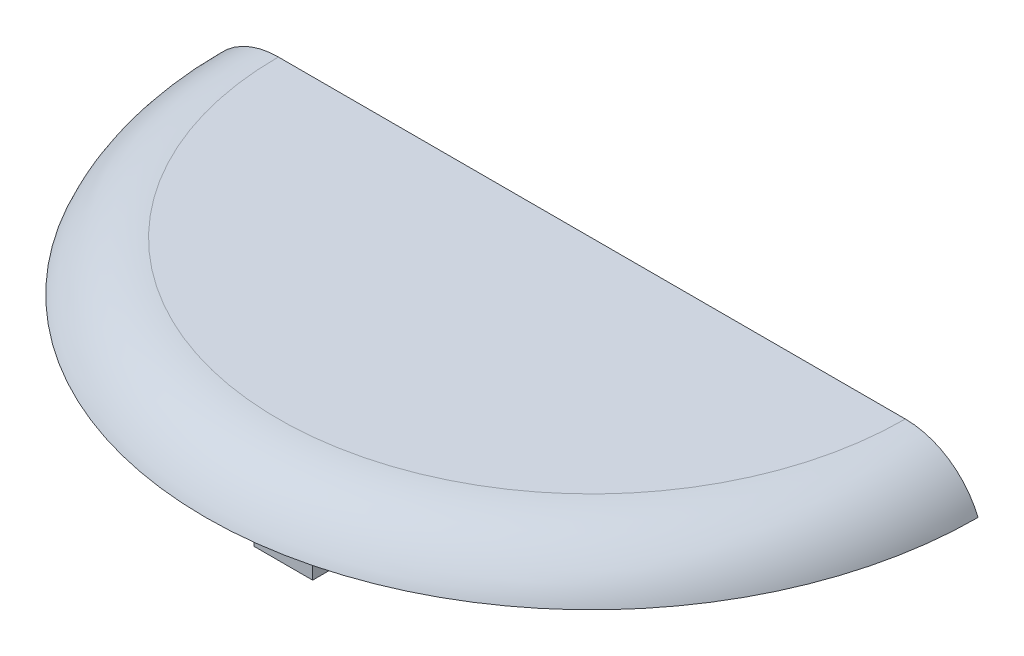
ISO-10303-21;
HEADER;
FILE_DESCRIPTION(('STEP AP214'),'2;1');
FILE_NAME('part.step','',(''),(''),'','','');
FILE_SCHEMA(('AUTOMOTIVE_DESIGN { 1 0 10303 214 1 1 1 1 }'));
ENDSEC;
DATA;
#1=APPLICATION_CONTEXT('core data for automotive mechanical design processes');
#2=APPLICATION_PROTOCOL_DEFINITION('international standard','automotive_design',2000,#1);
#3=PRODUCT_CONTEXT('',#1,'mechanical');
#4=PRODUCT('Part','Part','',(#3));
#5=PRODUCT_RELATED_PRODUCT_CATEGORY('part','',(#4));
#6=PRODUCT_DEFINITION_FORMATION('','',#4);
#7=PRODUCT_DEFINITION_CONTEXT('part definition',#1,'design');
#8=PRODUCT_DEFINITION('design','',#6,#7);
#9=PRODUCT_DEFINITION_SHAPE('','',#8);
#10=(LENGTH_UNIT() NAMED_UNIT(*) SI_UNIT(.MILLI.,.METRE.));
#11=(NAMED_UNIT(*) PLANE_ANGLE_UNIT() SI_UNIT($,.RADIAN.));
#12=(NAMED_UNIT(*) SI_UNIT($,.STERADIAN.) SOLID_ANGLE_UNIT());
#13=UNCERTAINTY_MEASURE_WITH_UNIT(LENGTH_MEASURE(1.E-05),#10,'distance_accuracy_value','');
#14=(GEOMETRIC_REPRESENTATION_CONTEXT(3) GLOBAL_UNCERTAINTY_ASSIGNED_CONTEXT((#13)) GLOBAL_UNIT_ASSIGNED_CONTEXT((#10,
#11,#12)) REPRESENTATION_CONTEXT('',''));
#15=CARTESIAN_POINT('',(0.,0.,0.));
#16=DIRECTION('',(0.,0.,1.));
#17=DIRECTION('',(1.,0.,0.));
#18=AXIS2_PLACEMENT_3D('',#15,#16,#17);
#19=CARTESIAN_POINT('',(0.,58.4278760968653,0.));
#20=DIRECTION('',(0.,1.,0.));
#21=DIRECTION('',(0.,0.,1.));
#22=AXIS2_PLACEMENT_3D('',#19,#20,#21);
#23=PLANE('',#22);
#24=DIRECTION('',(1.,0.,0.));
#25=VECTOR('',#24,1.);
#26=CARTESIAN_POINT('',(-3.,58.4278760968653,31.5));
#27=LINE('',#26,#25);
#28=CARTESIAN_POINT('',(-3.,58.4278760968653,31.5));
#29=VERTEX_POINT('',#28);
#30=CARTESIAN_POINT('',(3.,58.4278760968653,31.5));
#31=VERTEX_POINT('',#30);
#32=EDGE_CURVE('E123',#29,#31,#27,.T.);
#33=ORIENTED_EDGE('',*,*,#32,.T.);
#34=DIRECTION('',(0.,0.,-1.));
#35=VECTOR('',#34,1.);
#36=CARTESIAN_POINT('',(3.,58.4278760968653,28.5));
#37=LINE('',#36,#35);
#38=CARTESIAN_POINT('',(3.,58.4278760968653,28.5));
#39=VERTEX_POINT('',#38);
#40=EDGE_CURVE('E133',#31,#39,#37,.T.);
#41=ORIENTED_EDGE('',*,*,#40,.T.);
#42=DIRECTION('',(-1.,0.,0.));
#43=VECTOR('',#42,1.);
#44=CARTESIAN_POINT('',(-3.,58.4278760968653,28.5));
#45=LINE('',#44,#43);
#46=CARTESIAN_POINT('',(-3.,58.4278760968653,28.5));
#47=VERTEX_POINT('',#46);
#48=EDGE_CURVE('E100',#39,#47,#45,.T.);
#49=ORIENTED_EDGE('',*,*,#48,.T.);
#50=DIRECTION('',(0.,0.,1.));
#51=VECTOR('',#50,1.);
#52=CARTESIAN_POINT('',(-3.,58.4278760968653,28.5));
#53=LINE('',#52,#51);
#54=EDGE_CURVE('E57',#47,#29,#53,.T.);
#55=ORIENTED_EDGE('',*,*,#54,.T.);
#56=EDGE_LOOP('',(#33,#41,#49,#55));
#57=FACE_BOUND('',#56,.T.);
#58=CARTESIAN_POINT('',(0.,58.4278760968653,0.));
#59=DIRECTION('',(0.,1.,0.));
#60=DIRECTION('',(0.,0.,1.));
#61=AXIS2_PLACEMENT_3D('',#58,#59,#60);
#62=CIRCLE('',#61,39.4161984870957);
#63=CARTESIAN_POINT('',(39.4161984870957,58.4278760968653,0.));
#64=VERTEX_POINT('',#63);
#65=CARTESIAN_POINT('',(-39.4161984870957,58.4278760968653,2.77280175019557E-13));
#66=VERTEX_POINT('',#65);
#67=EDGE_CURVE('E12',#64,#66,#62,.F.);
#68=ORIENTED_EDGE('',*,*,#67,.T.);
#69=DIRECTION('',(-1.,0.,0.));
#70=VECTOR('',#69,1.);
#71=CARTESIAN_POINT('',(21.,58.4278760968653,0.));
#72=LINE('',#71,#70);
#73=EDGE_CURVE('E50',#64,#66,#72,.T.);
#74=ORIENTED_EDGE('',*,*,#73,.F.);
#75=EDGE_LOOP('',(#68,#74));
#76=FACE_BOUND('',#75,.T.);
#77=ADVANCED_FACE('F42',(#57,#76),#23,.F.);
#78=CARTESIAN_POINT('',(0.,60.9278760968653,15.));
#79=DIRECTION('',(0.,0.,-1.));
#80=DIRECTION('',(-1.,0.,0.));
#81=AXIS2_PLACEMENT_3D('',#78,#79,#80);
#82=PLANE('',#81);
#83=CARTESIAN_POINT('',(0.,60.9278760968653,15.));
#84=DIRECTION('',(0.,0.,-1.));
#85=DIRECTION('',(-1.,0.,0.));
#86=AXIS2_PLACEMENT_3D('',#83,#84,#85);
#87=CIRCLE('',#86,1.);
#88=CARTESIAN_POINT('',(-1.,60.9278760968653,15.));
#89=VERTEX_POINT('',#88);
#90=EDGE_CURVE('E165',#89,#89,#87,.T.);
#91=ORIENTED_EDGE('',*,*,#90,.T.);
#92=EDGE_LOOP('',(#91));
#93=FACE_BOUND('',#92,.T.);
#94=ADVANCED_FACE('F204',(#93),#82,.T.);
#95=CARTESIAN_POINT('',(-30.4161984870957,60.9278760968653,15.));
#96=DIRECTION('',(0.,0.,-1.));
#97=DIRECTION('',(-1.,0.,0.));
#98=AXIS2_PLACEMENT_3D('',#95,#96,#97);
#99=PLANE('',#98);
#100=CARTESIAN_POINT('',(-30.4161984870957,60.9278760968653,15.));
#101=DIRECTION('',(0.,0.,-1.));
#102=DIRECTION('',(-1.,0.,0.));
#103=AXIS2_PLACEMENT_3D('',#100,#101,#102);
#104=CIRCLE('',#103,0.999999999999998);
#105=CARTESIAN_POINT('',(-31.4161984870957,60.9278760968653,15.));
#106=VERTEX_POINT('',#105);
#107=EDGE_CURVE('E157',#106,#106,#104,.T.);
#108=ORIENTED_EDGE('',*,*,#107,.T.);
#109=EDGE_LOOP('',(#108));
#110=FACE_BOUND('',#109,.T.);
#111=ADVANCED_FACE('F200',(#110),#99,.T.);
#112=CARTESIAN_POINT('',(30.4161984870957,60.9278760968653,15.));
#113=DIRECTION('',(0.,0.,-1.));
#114=DIRECTION('',(-1.,0.,0.));
#115=AXIS2_PLACEMENT_3D('',#112,#113,#114);
#116=PLANE('',#115);
#117=CARTESIAN_POINT('',(30.4161984870957,60.9278760968653,15.));
#118=DIRECTION('',(0.,0.,-1.));
#119=DIRECTION('',(-1.,0.,0.));
#120=AXIS2_PLACEMENT_3D('',#117,#118,#119);
#121=CIRCLE('',#120,1.);
#122=CARTESIAN_POINT('',(29.4161984870957,60.9278760968653,15.));
#123=VERTEX_POINT('',#122);
#124=EDGE_CURVE('E148',#123,#123,#121,.T.);
#125=ORIENTED_EDGE('',*,*,#124,.T.);
#126=EDGE_LOOP('',(#125));
#127=FACE_BOUND('',#126,.T.);
#128=ADVANCED_FACE('F193',(#127),#116,.T.);
#129=CARTESIAN_POINT('',(0.,63.4278760968653,0.));
#130=DIRECTION('',(0.,1.,0.));
#131=DIRECTION('',(0.,0.,1.));
#132=AXIS2_PLACEMENT_3D('',#129,#130,#131);
#133=PLANE('',#132);
#134=DIRECTION('',(1.,0.,0.));
#135=VECTOR('',#134,1.);
#136=CARTESIAN_POINT('',(0.,63.4278760968653,0.));
#137=LINE('',#136,#135);
#138=CARTESIAN_POINT('',(-32.,63.4278760968653,2.51386656396706E-13));
#139=VERTEX_POINT('',#138);
#140=CARTESIAN_POINT('',(32.,63.4278760968653,0.));
#141=VERTEX_POINT('',#140);
#142=EDGE_CURVE('E181',#139,#141,#137,.T.);
#143=ORIENTED_EDGE('',*,*,#142,.F.);
#144=CARTESIAN_POINT('',(0.,63.4278760968653,0.));
#145=DIRECTION('',(0.,-1.,0.));
#146=DIRECTION('',(0.,0.,-1.));
#147=AXIS2_PLACEMENT_3D('',#144,#145,#146);
#148=CIRCLE('',#147,32.);
#149=EDGE_CURVE('E177',#141,#139,#148,.T.);
#150=ORIENTED_EDGE('',*,*,#149,.F.);
#151=EDGE_LOOP('',(#143,#150));
#152=FACE_BOUND('',#151,.T.);
#153=ADVANCED_FACE('F191',(#152),#133,.T.);
#154=CARTESIAN_POINT('',(0.,55.4278760968653,0.));
#155=DIRECTION('',(0.,-1.,0.));
#156=DIRECTION('',(0.,0.,-1.));
#157=AXIS2_PLACEMENT_3D('',#154,#155,#156);
#158=TOROIDAL_SURFACE('',#157,32.,8.);
#159=ORIENTED_EDGE('',*,*,#67,.F.);
#160=CARTESIAN_POINT('',(32.,55.4278760968653,-1.1172740284298E-13));
#161=DIRECTION('',(0.,0.,1.));
#162=DIRECTION('',(1.,0.,0.));
#163=AXIS2_PLACEMENT_3D('',#160,#161,#162);
#164=CIRCLE('',#163,8.);
#165=EDGE_CURVE('E152',#141,#64,#164,.F.);
#166=ORIENTED_EDGE('',*,*,#165,.F.);
#167=ORIENTED_EDGE('',*,*,#149,.T.);
#168=CARTESIAN_POINT('',(-32.,55.4278760968653,1.1172740284298E-13));
#169=DIRECTION('',(0.,0.,1.));
#170=DIRECTION('',(1.,0.,0.));
#171=AXIS2_PLACEMENT_3D('',#168,#169,#170);
#172=CIRCLE('',#171,8.);
#173=EDGE_CURVE('E174',#66,#139,#172,.F.);
#174=ORIENTED_EDGE('',*,*,#173,.F.);
#175=EDGE_LOOP('',(#159,#166,#167,#174));
#176=FACE_BOUND('',#175,.T.);
#177=ADVANCED_FACE('F190',(#176),#158,.T.);
#178=CARTESIAN_POINT('',(0.,60.9278760968653,15.));
#179=DIRECTION('',(0.,0.,-1.));
#180=DIRECTION('',(-1.,0.,0.));
#181=AXIS2_PLACEMENT_3D('',#178,#179,#180);
#182=CYLINDRICAL_SURFACE('',#181,1.);
#183=ORIENTED_EDGE('',*,*,#90,.F.);
#184=EDGE_LOOP('',(#183));
#185=FACE_BOUND('',#184,.T.);
#186=CARTESIAN_POINT('',(0.,60.9278760968653,0.));
#187=DIRECTION('',(0.,0.,-1.));
#188=DIRECTION('',(-1.,0.,0.));
#189=AXIS2_PLACEMENT_3D('',#186,#187,#188);
#190=CIRCLE('',#189,1.);
#191=CARTESIAN_POINT('',(-1.,60.9278760968653,0.));
#192=VERTEX_POINT('',#191);
#193=EDGE_CURVE('E142',#192,#192,#190,.T.);
#194=ORIENTED_EDGE('',*,*,#193,.T.);
#195=EDGE_LOOP('',(#194));
#196=FACE_BOUND('',#195,.T.);
#197=ADVANCED_FACE('F197',(#185,#196),#182,.F.);
#198=CARTESIAN_POINT('',(-30.4161984870957,60.9278760968653,15.));
#199=DIRECTION('',(0.,0.,-1.));
#200=DIRECTION('',(-1.,0.,0.));
#201=AXIS2_PLACEMENT_3D('',#198,#199,#200);
#202=CYLINDRICAL_SURFACE('',#201,0.999999999999998);
#203=ORIENTED_EDGE('',*,*,#107,.F.);
#204=EDGE_LOOP('',(#203));
#205=FACE_BOUND('',#204,.T.);
#206=CARTESIAN_POINT('',(-30.4161984870957,60.9278760968653,0.));
#207=DIRECTION('',(0.,0.,-1.));
#208=DIRECTION('',(-1.,0.,0.));
#209=AXIS2_PLACEMENT_3D('',#206,#207,#208);
#210=CIRCLE('',#209,0.999999999999998);
#211=CARTESIAN_POINT('',(-31.4161984870957,60.9278760968653,0.));
#212=VERTEX_POINT('',#211);
#213=EDGE_CURVE('E161',#212,#212,#210,.T.);
#214=ORIENTED_EDGE('',*,*,#213,.T.);
#215=EDGE_LOOP('',(#214));
#216=FACE_BOUND('',#215,.T.);
#217=ADVANCED_FACE('F223',(#205,#216),#202,.F.);
#218=CARTESIAN_POINT('',(30.4161984870957,60.9278760968653,15.));
#219=DIRECTION('',(0.,0.,-1.));
#220=DIRECTION('',(-1.,0.,0.));
#221=AXIS2_PLACEMENT_3D('',#218,#219,#220);
#222=CYLINDRICAL_SURFACE('',#221,1.);
#223=ORIENTED_EDGE('',*,*,#124,.F.);
#224=EDGE_LOOP('',(#223));
#225=FACE_BOUND('',#224,.T.);
#226=CARTESIAN_POINT('',(30.4161984870957,60.9278760968653,0.));
#227=DIRECTION('',(0.,0.,-1.));
#228=DIRECTION('',(-1.,0.,0.));
#229=AXIS2_PLACEMENT_3D('',#226,#227,#228);
#230=CIRCLE('',#229,1.);
#231=CARTESIAN_POINT('',(29.4161984870957,60.9278760968653,0.));
#232=VERTEX_POINT('',#231);
#233=EDGE_CURVE('E153',#232,#232,#230,.T.);
#234=ORIENTED_EDGE('',*,*,#233,.T.);
#235=EDGE_LOOP('',(#234));
#236=FACE_BOUND('',#235,.T.);
#237=ADVANCED_FACE('F215',(#225,#236),#222,.F.);
#238=CARTESIAN_POINT('',(21.,73.,0.));
#239=DIRECTION('',(0.,0.,1.));
#240=DIRECTION('',(1.,0.,0.));
#241=AXIS2_PLACEMENT_3D('',#238,#239,#240);
#242=PLANE('',#241);
#243=ORIENTED_EDGE('',*,*,#233,.F.);
#244=EDGE_LOOP('',(#243));
#245=FACE_BOUND('',#244,.T.);
#246=ORIENTED_EDGE('',*,*,#213,.F.);
#247=EDGE_LOOP('',(#246));
#248=FACE_BOUND('',#247,.T.);
#249=ORIENTED_EDGE('',*,*,#193,.F.);
#250=EDGE_LOOP('',(#249));
#251=FACE_BOUND('',#250,.T.);
#252=ORIENTED_EDGE('',*,*,#165,.T.);
#253=ORIENTED_EDGE('',*,*,#73,.T.);
#254=ORIENTED_EDGE('',*,*,#173,.T.);
#255=ORIENTED_EDGE('',*,*,#142,.T.);
#256=EDGE_LOOP('',(#252,#253,#254,#255));
#257=FACE_BOUND('',#256,.T.);
#258=ADVANCED_FACE('F185',(#245,#248,#251,#257),#242,.F.);
#259=CARTESIAN_POINT('',(3.,50.4278760968653,28.5));
#260=DIRECTION('',(1.,0.,0.));
#261=DIRECTION('',(0.,0.,-1.));
#262=AXIS2_PLACEMENT_3D('',#259,#260,#261);
#263=PLANE('',#262);
#264=ORIENTED_EDGE('',*,*,#40,.F.);
#265=DIRECTION('',(0.,1.,0.));
#266=VECTOR('',#265,1.);
#267=CARTESIAN_POINT('',(3.,50.4278760968653,31.5));
#268=LINE('',#267,#266);
#269=CARTESIAN_POINT('',(3.,50.4278760968653,31.5));
#270=VERTEX_POINT('',#269);
#271=EDGE_CURVE('E121',#270,#31,#268,.T.);
#272=ORIENTED_EDGE('',*,*,#271,.F.);
#273=DIRECTION('',(0.,0.,-1.));
#274=VECTOR('',#273,1.);
#275=CARTESIAN_POINT('',(3.,50.4278760968653,28.5));
#276=LINE('',#275,#274);
#277=CARTESIAN_POINT('',(3.,50.4278760968653,28.5));
#278=VERTEX_POINT('',#277);
#279=EDGE_CURVE('E114',#270,#278,#276,.T.);
#280=ORIENTED_EDGE('',*,*,#279,.T.);
#281=DIRECTION('',(0.,1.,0.));
#282=VECTOR('',#281,1.);
#283=CARTESIAN_POINT('',(3.,50.4278760968653,28.5));
#284=LINE('',#283,#282);
#285=EDGE_CURVE('E95',#278,#39,#284,.T.);
#286=ORIENTED_EDGE('',*,*,#285,.T.);
#287=EDGE_LOOP('',(#264,#272,#280,#286));
#288=FACE_BOUND('',#287,.T.);
#289=ADVANCED_FACE('F120',(#288),#263,.T.);
#290=CARTESIAN_POINT('',(-3.,50.4278760968653,31.5));
#291=DIRECTION('',(0.,0.,1.));
#292=DIRECTION('',(1.,0.,0.));
#293=AXIS2_PLACEMENT_3D('',#290,#291,#292);
#294=PLANE('',#293);
#295=ORIENTED_EDGE('',*,*,#32,.F.);
#296=DIRECTION('',(0.,1.,0.));
#297=VECTOR('',#296,1.);
#298=CARTESIAN_POINT('',(-3.,50.4278760968653,31.5));
#299=LINE('',#298,#297);
#300=CARTESIAN_POINT('',(-3.,50.4278760968653,31.5));
#301=VERTEX_POINT('',#300);
#302=EDGE_CURVE('E143',#301,#29,#299,.T.);
#303=ORIENTED_EDGE('',*,*,#302,.F.);
#304=DIRECTION('',(1.,0.,0.));
#305=VECTOR('',#304,1.);
#306=CARTESIAN_POINT('',(-3.,50.4278760968653,31.5));
#307=LINE('',#306,#305);
#308=EDGE_CURVE('E107',#301,#270,#307,.T.);
#309=ORIENTED_EDGE('',*,*,#308,.T.);
#310=ORIENTED_EDGE('',*,*,#271,.T.);
#311=EDGE_LOOP('',(#295,#303,#309,#310));
#312=FACE_BOUND('',#311,.T.);
#313=ADVANCED_FACE('F220',(#312),#294,.T.);
#314=CARTESIAN_POINT('',(-3.,50.4278760968653,28.5));
#315=DIRECTION('',(-1.,0.,0.));
#316=DIRECTION('',(0.,0.,1.));
#317=AXIS2_PLACEMENT_3D('',#314,#315,#316);
#318=PLANE('',#317);
#319=ORIENTED_EDGE('',*,*,#54,.F.);
#320=DIRECTION('',(0.,1.,0.));
#321=VECTOR('',#320,1.);
#322=CARTESIAN_POINT('',(-3.,50.4278760968653,28.5));
#323=LINE('',#322,#321);
#324=CARTESIAN_POINT('',(-3.,50.4278760968653,28.5));
#325=VERTEX_POINT('',#324);
#326=EDGE_CURVE('E106',#325,#47,#323,.T.);
#327=ORIENTED_EDGE('',*,*,#326,.F.);
#328=DIRECTION('',(0.,0.,1.));
#329=VECTOR('',#328,1.);
#330=CARTESIAN_POINT('',(-3.,50.4278760968653,28.5));
#331=LINE('',#330,#329);
#332=EDGE_CURVE('E117',#325,#301,#331,.T.);
#333=ORIENTED_EDGE('',*,*,#332,.T.);
#334=ORIENTED_EDGE('',*,*,#302,.T.);
#335=EDGE_LOOP('',(#319,#327,#333,#334));
#336=FACE_BOUND('',#335,.T.);
#337=ADVANCED_FACE('F240',(#336),#318,.T.);
#338=CARTESIAN_POINT('',(-3.,50.4278760968653,28.5));
#339=DIRECTION('',(0.,0.,-1.));
#340=DIRECTION('',(-1.,0.,0.));
#341=AXIS2_PLACEMENT_3D('',#338,#339,#340);
#342=PLANE('',#341);
#343=ORIENTED_EDGE('',*,*,#48,.F.);
#344=ORIENTED_EDGE('',*,*,#285,.F.);
#345=DIRECTION('',(-1.,0.,0.));
#346=VECTOR('',#345,1.);
#347=CARTESIAN_POINT('',(-3.,50.4278760968653,28.5));
#348=LINE('',#347,#346);
#349=EDGE_CURVE('E98',#278,#325,#348,.T.);
#350=ORIENTED_EDGE('',*,*,#349,.T.);
#351=ORIENTED_EDGE('',*,*,#326,.T.);
#352=EDGE_LOOP('',(#343,#344,#350,#351));
#353=FACE_BOUND('',#352,.T.);
#354=ADVANCED_FACE('F97',(#353),#342,.T.);
#355=CARTESIAN_POINT('',(0.,50.4278760968653,0.));
#356=DIRECTION('',(0.,1.,0.));
#357=DIRECTION('',(0.,0.,1.));
#358=AXIS2_PLACEMENT_3D('',#355,#356,#357);
#359=PLANE('',#358);
#360=ORIENTED_EDGE('',*,*,#279,.F.);
#361=ORIENTED_EDGE('',*,*,#308,.F.);
#362=ORIENTED_EDGE('',*,*,#332,.F.);
#363=ORIENTED_EDGE('',*,*,#349,.F.);
#364=EDGE_LOOP('',(#360,#361,#362,#363));
#365=FACE_BOUND('',#364,.T.);
#366=ADVANCED_FACE('F112',(#365),#359,.F.);
#367=CLOSED_SHELL('',(#77,#94,#111,#128,#153,#177,#197,#217,#237,#258,#289,#313,#337,#354,#366));
#368=MANIFOLD_SOLID_BREP('B2',#367);
#369=ADVANCED_BREP_SHAPE_REPRESENTATION('',(#18,#368),#14);
#370=SHAPE_DEFINITION_REPRESENTATION(#9,#369);
ENDSEC;
END-ISO-10303-21;
